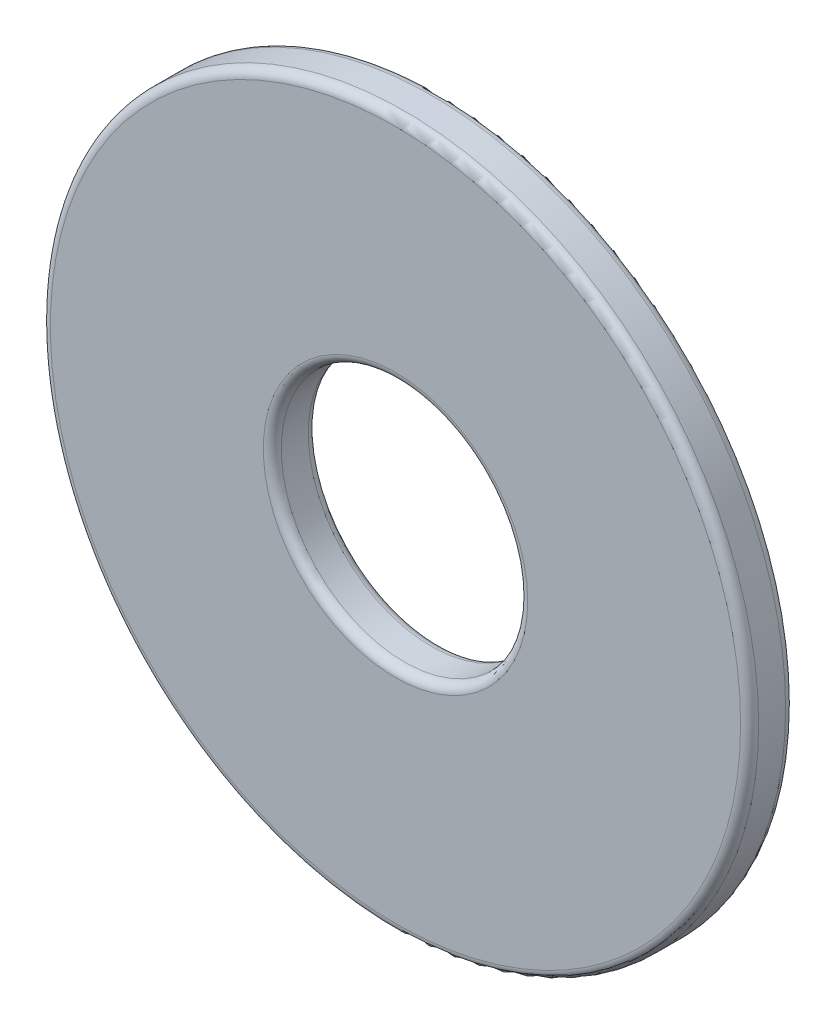
ISO-10303-21;
HEADER;
FILE_DESCRIPTION(('STEP AP214'),'2;1');
FILE_NAME('part.step','',(''),(''),'','','');
FILE_SCHEMA(('AUTOMOTIVE_DESIGN { 1 0 10303 214 1 1 1 1 }'));
ENDSEC;
DATA;
#1=APPLICATION_CONTEXT('core data for automotive mechanical design processes');
#2=APPLICATION_PROTOCOL_DEFINITION('international standard','automotive_design',2000,#1);
#3=PRODUCT_CONTEXT('',#1,'mechanical');
#4=PRODUCT('Part','Part','',(#3));
#5=PRODUCT_RELATED_PRODUCT_CATEGORY('part','',(#4));
#6=PRODUCT_DEFINITION_FORMATION('','',#4);
#7=PRODUCT_DEFINITION_CONTEXT('part definition',#1,'design');
#8=PRODUCT_DEFINITION('design','',#6,#7);
#9=PRODUCT_DEFINITION_SHAPE('','',#8);
#10=(LENGTH_UNIT() NAMED_UNIT(*) SI_UNIT(.MILLI.,.METRE.));
#11=(NAMED_UNIT(*) PLANE_ANGLE_UNIT() SI_UNIT($,.RADIAN.));
#12=(NAMED_UNIT(*) SI_UNIT($,.STERADIAN.) SOLID_ANGLE_UNIT());
#13=UNCERTAINTY_MEASURE_WITH_UNIT(LENGTH_MEASURE(1.E-05),#10,'distance_accuracy_value','');
#14=(GEOMETRIC_REPRESENTATION_CONTEXT(3) GLOBAL_UNCERTAINTY_ASSIGNED_CONTEXT((#13)) GLOBAL_UNIT_ASSIGNED_CONTEXT((#10,
#11,#12)) REPRESENTATION_CONTEXT('',''));
#15=CARTESIAN_POINT('',(0.,0.,0.));
#16=DIRECTION('',(0.,0.,1.));
#17=DIRECTION('',(1.,0.,0.));
#18=AXIS2_PLACEMENT_3D('',#15,#16,#17);
#19=CARTESIAN_POINT('',(0.,0.,-0.806450000000005));
#20=DIRECTION('',(0.,0.,1.));
#21=DIRECTION('',(1.,0.,0.));
#22=AXIS2_PLACEMENT_3D('',#19,#20,#21);
#23=CYLINDRICAL_SURFACE('',#22,12.7);
#24=CARTESIAN_POINT('',(0.,0.,0.483870000000004));
#25=DIRECTION('',(0.,0.,1.));
#26=DIRECTION('',(1.,0.,0.));
#27=AXIS2_PLACEMENT_3D('',#24,#25,#26);
#28=CIRCLE('',#27,12.7);
#29=CARTESIAN_POINT('',(12.7,0.,0.483870000000004));
#30=VERTEX_POINT('',#29);
#31=EDGE_CURVE('E10',#30,#30,#28,.F.);
#32=CARTESIAN_POINT('',(0.,0.,-0.483870000000005));
#33=DIRECTION('',(0.,0.,1.));
#34=DIRECTION('',(1.,0.,0.));
#35=AXIS2_PLACEMENT_3D('',#32,#33,#34);
#36=CIRCLE('',#35,12.7);
#37=CARTESIAN_POINT('',(12.7,0.,-0.483870000000005));
#38=VERTEX_POINT('',#37);
#39=EDGE_CURVE('E42',#38,#38,#36,.T.);
#40=CARTESIAN_POINT('',(12.7,0.,0.483870000000004));
#41=CARTESIAN_POINT('',(12.7,0.,0.473789375000004));
#42=CARTESIAN_POINT('',(12.7,0.,0.463708750000004));
#43=CARTESIAN_POINT('',(12.7,0.,0.443547500000003));
#44=CARTESIAN_POINT('',(12.7,0.,0.433466875000003));
#45=CARTESIAN_POINT('',(12.7,0.,0.413305625000003));
#46=CARTESIAN_POINT('',(12.7,0.,0.403225000000003));
#47=CARTESIAN_POINT('',(12.7,0.,0.383063750000003));
#48=CARTESIAN_POINT('',(12.7,0.,0.372983125000003));
#49=CARTESIAN_POINT('',(12.7,0.,0.352821875000003));
#50=CARTESIAN_POINT('',(12.7,0.,0.342741250000003));
#51=CARTESIAN_POINT('',(12.7,0.,0.322580000000002));
#52=CARTESIAN_POINT('',(12.7,0.,0.312499375000002));
#53=CARTESIAN_POINT('',(12.7,0.,0.292338125000002));
#54=CARTESIAN_POINT('',(12.7,0.,0.282257500000002));
#55=CARTESIAN_POINT('',(12.7,0.,0.262096250000002));
#56=CARTESIAN_POINT('',(12.7,0.,0.252015625000002));
#57=CARTESIAN_POINT('',(12.7,0.,0.231854375000001));
#58=CARTESIAN_POINT('',(12.7,0.,0.221773750000001));
#59=CARTESIAN_POINT('',(12.7,0.,0.201612500000001));
#60=CARTESIAN_POINT('',(12.7,0.,0.191531875000001));
#61=CARTESIAN_POINT('',(12.7,0.,0.171370625000001));
#62=CARTESIAN_POINT('',(12.7,0.,0.161290000000001));
#63=CARTESIAN_POINT('',(12.7,0.,0.141128750000001));
#64=CARTESIAN_POINT('',(12.7,0.,0.131048125000001));
#65=CARTESIAN_POINT('',(12.7,0.,0.110886875));
#66=CARTESIAN_POINT('',(12.7,0.,0.10080625));
#67=CARTESIAN_POINT('',(12.7,0.,0.0806450000000002));
#68=CARTESIAN_POINT('',(12.7,0.,0.0705643750000001));
#69=CARTESIAN_POINT('',(12.7,0.,0.0504031249999999));
#70=CARTESIAN_POINT('',(12.7,0.,0.0403224999999997));
#71=CARTESIAN_POINT('',(12.7,0.,0.0201612499999995));
#72=CARTESIAN_POINT('',(12.7,0.,0.0100806249999994));
#73=CARTESIAN_POINT('',(12.7,0.,-0.0100806250000007));
#74=CARTESIAN_POINT('',(12.7,0.,-0.0201612500000008));
#75=CARTESIAN_POINT('',(12.7,0.,-0.040322500000001));
#76=CARTESIAN_POINT('',(12.7,0.,-0.0504031250000011));
#77=CARTESIAN_POINT('',(12.7,0.,-0.0705643750000013));
#78=CARTESIAN_POINT('',(12.7,0.,-0.0806450000000014));
#79=CARTESIAN_POINT('',(12.7,0.,-0.100806250000002));
#80=CARTESIAN_POINT('',(12.7,0.,-0.110886875000002));
#81=CARTESIAN_POINT('',(12.7,0.,-0.131048125000002));
#82=CARTESIAN_POINT('',(12.7,0.,-0.141128750000002));
#83=CARTESIAN_POINT('',(12.7,0.,-0.161290000000002));
#84=CARTESIAN_POINT('',(12.7,0.,-0.171370625000002));
#85=CARTESIAN_POINT('',(12.7,0.,-0.191531875000002));
#86=CARTESIAN_POINT('',(12.7,0.,-0.201612500000003));
#87=CARTESIAN_POINT('',(12.7,0.,-0.221773750000003));
#88=CARTESIAN_POINT('',(12.7,0.,-0.231854375000003));
#89=CARTESIAN_POINT('',(12.7,0.,-0.252015625000003));
#90=CARTESIAN_POINT('',(12.7,0.,-0.262096250000003));
#91=CARTESIAN_POINT('',(12.7,0.,-0.282257500000003));
#92=CARTESIAN_POINT('',(12.7,0.,-0.292338125000003));
#93=CARTESIAN_POINT('',(12.7,0.,-0.312499375000004));
#94=CARTESIAN_POINT('',(12.7,0.,-0.322580000000004));
#95=CARTESIAN_POINT('',(12.7,0.,-0.342741250000004));
#96=CARTESIAN_POINT('',(12.7,0.,-0.352821875000004));
#97=CARTESIAN_POINT('',(12.7,0.,-0.372983125000004));
#98=CARTESIAN_POINT('',(12.7,0.,-0.383063750000004));
#99=CARTESIAN_POINT('',(12.7,0.,-0.403225000000004));
#100=CARTESIAN_POINT('',(12.7,0.,-0.413305625000005));
#101=CARTESIAN_POINT('',(12.7,0.,-0.433466875000005));
#102=CARTESIAN_POINT('',(12.7,0.,-0.443547500000005));
#103=CARTESIAN_POINT('',(12.7,0.,-0.463708750000005));
#104=CARTESIAN_POINT('',(12.7,0.,-0.473789375000005));
#105=CARTESIAN_POINT('',(12.7,0.,-0.483870000000005));
#106=B_SPLINE_CURVE_WITH_KNOTS('',3,(#40,#41,#42,#43,#44,#45,#46,#47,#48,#49,#50,#51,#52,#53,
#54,#55,#56,#57,#58,#59,#60,#61,#62,#63,#64,#65,#66,#67,#68,#69,#70,#71,#72,#73,#74,#75,#76,#77,
#78,#79,#80,#81,#82,#83,#84,#85,#86,#87,#88,#89,#90,#91,#92,#93,#94,#95,#96,#97,#98,#99,#100,
#101,#102,#103,#104,#105),.UNSPECIFIED.,.F.,.F.,(4,2,2,2,2,2,2,2,2,2,2,2,2,2,2,2,2,2,2,2,2,2,2,
2,2,2,2,2,2,2,2,2,4),(0.,0.0302418750000003,0.0604837500000005,0.0907256250000008,
0.120967500000001,0.151209375000001,0.181451250000002,0.211693125000002,0.241935000000002,
0.272176875000003,0.302418750000003,0.332660625000003,0.362902500000003,0.393144375000004,
0.423386250000004,0.453628125000004,0.483870000000005,0.514111875000005,0.544353750000005,
0.574595625000005,0.604837500000006,0.635079375000006,0.665321250000006,0.695563125000006,
0.725805000000007,0.756046875000007,0.786288750000007,0.816530625000008,0.846772500000008,
0.877014375000008,0.907256250000009,0.937498125000009,0.967740000000009),.UNSPECIFIED.);
#107=EDGE_CURVE('BSEAM35',#30,#38,#106,.T.);
#108=ORIENTED_EDGE('',*,*,#31,.T.);
#109=ORIENTED_EDGE('',*,*,#39,.T.);
#110=ORIENTED_EDGE('',*,*,#107,.T.);
#111=ORIENTED_EDGE('',*,*,#107,.F.);
#112=EDGE_LOOP('',(#108,#110,#109,#111));
#113=FACE_BOUND('',#112,.T.);
#114=ADVANCED_FACE('F35',(#113),#23,.T.);
#115=CARTESIAN_POINT('',(0.,0.,-0.806450000000005));
#116=DIRECTION('',(0.,0.,1.));
#117=DIRECTION('',(1.,0.,0.));
#118=AXIS2_PLACEMENT_3D('',#115,#116,#117);
#119=PLANE('',#118);
#120=CARTESIAN_POINT('',(0.,0.,-0.806450000000005));
#121=DIRECTION('',(0.,0.,1.));
#122=DIRECTION('',(1.,0.,0.));
#123=AXIS2_PLACEMENT_3D('',#120,#121,#122);
#124=CIRCLE('',#123,4.74218);
#125=CARTESIAN_POINT('',(4.74218,0.,-0.806450000000005));
#126=VERTEX_POINT('',#125);
#127=EDGE_CURVE('E46',#126,#126,#124,.T.);
#128=ORIENTED_EDGE('',*,*,#127,.T.);
#129=EDGE_LOOP('',(#128));
#130=FACE_BOUND('',#129,.T.);
#131=CARTESIAN_POINT('',(0.,0.,-0.806450000000005));
#132=DIRECTION('',(0.,0.,1.));
#133=DIRECTION('',(1.,0.,0.));
#134=AXIS2_PLACEMENT_3D('',#131,#132,#133);
#135=CIRCLE('',#134,12.37742);
#136=CARTESIAN_POINT('',(12.37742,0.,-0.806450000000005));
#137=VERTEX_POINT('',#136);
#138=EDGE_CURVE('E50',#137,#137,#135,.F.);
#139=ORIENTED_EDGE('',*,*,#138,.T.);
#140=EDGE_LOOP('',(#139));
#141=FACE_BOUND('',#140,.T.);
#142=ADVANCED_FACE('F78',(#130,#141),#119,.F.);
#143=CARTESIAN_POINT('',(0.,0.,0.806450000000004));
#144=DIRECTION('',(0.,0.,1.));
#145=DIRECTION('',(1.,0.,0.));
#146=AXIS2_PLACEMENT_3D('',#143,#144,#145);
#147=PLANE('',#146);
#148=CARTESIAN_POINT('',(0.,0.,0.806450000000004));
#149=DIRECTION('',(0.,0.,1.));
#150=DIRECTION('',(1.,0.,0.));
#151=AXIS2_PLACEMENT_3D('',#148,#149,#150);
#152=CIRCLE('',#151,4.74218);
#153=CARTESIAN_POINT('',(4.74218,0.,0.806450000000004));
#154=VERTEX_POINT('',#153);
#155=EDGE_CURVE('E55',#154,#154,#152,.F.);
#156=ORIENTED_EDGE('',*,*,#155,.T.);
#157=EDGE_LOOP('',(#156));
#158=FACE_BOUND('',#157,.T.);
#159=CARTESIAN_POINT('',(0.,0.,0.806450000000004));
#160=DIRECTION('',(0.,0.,1.));
#161=DIRECTION('',(1.,0.,0.));
#162=AXIS2_PLACEMENT_3D('',#159,#160,#161);
#163=CIRCLE('',#162,12.37742);
#164=CARTESIAN_POINT('',(12.37742,0.,0.806450000000004));
#165=VERTEX_POINT('',#164);
#166=EDGE_CURVE('E58',#165,#165,#163,.T.);
#167=ORIENTED_EDGE('',*,*,#166,.T.);
#168=EDGE_LOOP('',(#167));
#169=FACE_BOUND('',#168,.T.);
#170=ADVANCED_FACE('F81',(#158,#169),#147,.T.);
#171=CARTESIAN_POINT('',(0.,0.,-0.806450000000005));
#172=DIRECTION('',(0.,0.,1.));
#173=DIRECTION('',(1.,0.,0.));
#174=AXIS2_PLACEMENT_3D('',#171,#172,#173);
#175=CYLINDRICAL_SURFACE('',#174,4.4196);
#176=CARTESIAN_POINT('',(0.,0.,0.483870000000004));
#177=DIRECTION('',(0.,0.,1.));
#178=DIRECTION('',(1.,0.,0.));
#179=AXIS2_PLACEMENT_3D('',#176,#177,#178);
#180=CIRCLE('',#179,4.4196);
#181=CARTESIAN_POINT('',(4.4196,0.,0.483870000000004));
#182=VERTEX_POINT('',#181);
#183=EDGE_CURVE('E61',#182,#182,#180,.T.);
#184=CARTESIAN_POINT('',(0.,0.,-0.483870000000005));
#185=DIRECTION('',(0.,0.,1.));
#186=DIRECTION('',(1.,0.,0.));
#187=AXIS2_PLACEMENT_3D('',#184,#185,#186);
#188=CIRCLE('',#187,4.4196);
#189=CARTESIAN_POINT('',(4.4196,0.,-0.483870000000005));
#190=VERTEX_POINT('',#189);
#191=EDGE_CURVE('E64',#190,#190,#188,.F.);
#192=CARTESIAN_POINT('',(4.4196,0.,0.483870000000004));
#193=CARTESIAN_POINT('',(4.4196,0.,0.473789375000004));
#194=CARTESIAN_POINT('',(4.4196,0.,0.463708750000004));
#195=CARTESIAN_POINT('',(4.4196,0.,0.443547500000003));
#196=CARTESIAN_POINT('',(4.4196,0.,0.433466875000003));
#197=CARTESIAN_POINT('',(4.4196,0.,0.413305625000003));
#198=CARTESIAN_POINT('',(4.4196,0.,0.403225000000003));
#199=CARTESIAN_POINT('',(4.4196,0.,0.383063750000003));
#200=CARTESIAN_POINT('',(4.4196,0.,0.372983125000003));
#201=CARTESIAN_POINT('',(4.4196,0.,0.352821875000003));
#202=CARTESIAN_POINT('',(4.4196,0.,0.342741250000003));
#203=CARTESIAN_POINT('',(4.4196,0.,0.322580000000002));
#204=CARTESIAN_POINT('',(4.4196,0.,0.312499375000002));
#205=CARTESIAN_POINT('',(4.4196,0.,0.292338125000002));
#206=CARTESIAN_POINT('',(4.4196,0.,0.282257500000002));
#207=CARTESIAN_POINT('',(4.4196,0.,0.262096250000002));
#208=CARTESIAN_POINT('',(4.4196,0.,0.252015625000002));
#209=CARTESIAN_POINT('',(4.4196,0.,0.231854375000001));
#210=CARTESIAN_POINT('',(4.4196,0.,0.221773750000001));
#211=CARTESIAN_POINT('',(4.4196,0.,0.201612500000001));
#212=CARTESIAN_POINT('',(4.4196,0.,0.191531875000001));
#213=CARTESIAN_POINT('',(4.4196,0.,0.171370625000001));
#214=CARTESIAN_POINT('',(4.4196,0.,0.161290000000001));
#215=CARTESIAN_POINT('',(4.4196,0.,0.141128750000001));
#216=CARTESIAN_POINT('',(4.4196,0.,0.131048125000001));
#217=CARTESIAN_POINT('',(4.4196,0.,0.110886875));
#218=CARTESIAN_POINT('',(4.4196,0.,0.10080625));
#219=CARTESIAN_POINT('',(4.4196,0.,0.0806450000000002));
#220=CARTESIAN_POINT('',(4.4196,0.,0.0705643750000001));
#221=CARTESIAN_POINT('',(4.4196,0.,0.0504031249999999));
#222=CARTESIAN_POINT('',(4.4196,0.,0.0403224999999997));
#223=CARTESIAN_POINT('',(4.4196,0.,0.0201612499999995));
#224=CARTESIAN_POINT('',(4.4196,0.,0.0100806249999994));
#225=CARTESIAN_POINT('',(4.4196,0.,-0.0100806250000007));
#226=CARTESIAN_POINT('',(4.4196,0.,-0.0201612500000008));
#227=CARTESIAN_POINT('',(4.4196,0.,-0.040322500000001));
#228=CARTESIAN_POINT('',(4.4196,0.,-0.0504031250000011));
#229=CARTESIAN_POINT('',(4.4196,0.,-0.0705643750000013));
#230=CARTESIAN_POINT('',(4.4196,0.,-0.0806450000000014));
#231=CARTESIAN_POINT('',(4.4196,0.,-0.100806250000002));
#232=CARTESIAN_POINT('',(4.4196,0.,-0.110886875000002));
#233=CARTESIAN_POINT('',(4.4196,0.,-0.131048125000002));
#234=CARTESIAN_POINT('',(4.4196,0.,-0.141128750000002));
#235=CARTESIAN_POINT('',(4.4196,0.,-0.161290000000002));
#236=CARTESIAN_POINT('',(4.4196,0.,-0.171370625000002));
#237=CARTESIAN_POINT('',(4.4196,0.,-0.191531875000002));
#238=CARTESIAN_POINT('',(4.4196,0.,-0.201612500000003));
#239=CARTESIAN_POINT('',(4.4196,0.,-0.221773750000003));
#240=CARTESIAN_POINT('',(4.4196,0.,-0.231854375000003));
#241=CARTESIAN_POINT('',(4.4196,0.,-0.252015625000003));
#242=CARTESIAN_POINT('',(4.4196,0.,-0.262096250000003));
#243=CARTESIAN_POINT('',(4.4196,0.,-0.282257500000003));
#244=CARTESIAN_POINT('',(4.4196,0.,-0.292338125000003));
#245=CARTESIAN_POINT('',(4.4196,0.,-0.312499375000004));
#246=CARTESIAN_POINT('',(4.4196,0.,-0.322580000000004));
#247=CARTESIAN_POINT('',(4.4196,0.,-0.342741250000004));
#248=CARTESIAN_POINT('',(4.4196,0.,-0.352821875000004));
#249=CARTESIAN_POINT('',(4.4196,0.,-0.372983125000004));
#250=CARTESIAN_POINT('',(4.4196,0.,-0.383063750000004));
#251=CARTESIAN_POINT('',(4.4196,0.,-0.403225000000004));
#252=CARTESIAN_POINT('',(4.4196,0.,-0.413305625000005));
#253=CARTESIAN_POINT('',(4.4196,0.,-0.433466875000005));
#254=CARTESIAN_POINT('',(4.4196,0.,-0.443547500000005));
#255=CARTESIAN_POINT('',(4.4196,0.,-0.463708750000005));
#256=CARTESIAN_POINT('',(4.4196,0.,-0.473789375000005));
#257=CARTESIAN_POINT('',(4.4196,0.,-0.483870000000005));
#258=B_SPLINE_CURVE_WITH_KNOTS('',3,(#192,#193,#194,#195,#196,#197,#198,#199,#200,#201,#202,
#203,#204,#205,#206,#207,#208,#209,#210,#211,#212,#213,#214,#215,#216,#217,#218,#219,#220,#221,
#222,#223,#224,#225,#226,#227,#228,#229,#230,#231,#232,#233,#234,#235,#236,#237,#238,#239,#240,
#241,#242,#243,#244,#245,#246,#247,#248,#249,#250,#251,#252,#253,#254,#255,#256,#257),
.UNSPECIFIED.,.F.,.F.,(4,2,2,2,2,2,2,2,2,2,2,2,2,2,2,2,2,2,2,2,2,2,2,2,2,2,2,2,2,2,2,2,4),(0.,
0.0302418750000003,0.0604837500000005,0.0907256250000008,0.120967500000001,0.151209375000001,
0.181451250000002,0.211693125000002,0.241935000000002,0.272176875000003,0.302418750000003,
0.332660625000003,0.362902500000003,0.393144375000004,0.423386250000004,0.453628125000004,
0.483870000000005,0.514111875000005,0.544353750000005,0.574595625000005,0.604837500000006,
0.635079375000006,0.665321250000006,0.695563125000006,0.725805000000007,0.756046875000007,
0.786288750000007,0.816530625000008,0.846772500000008,0.877014375000008,0.907256250000009,
0.937498125000009,0.967740000000009),.UNSPECIFIED.);
#259=EDGE_CURVE('BSEAM68',#182,#190,#258,.T.);
#260=ORIENTED_EDGE('',*,*,#183,.T.);
#261=ORIENTED_EDGE('',*,*,#191,.T.);
#262=ORIENTED_EDGE('',*,*,#259,.T.);
#263=ORIENTED_EDGE('',*,*,#259,.F.);
#264=EDGE_LOOP('',(#260,#262,#261,#263));
#265=FACE_BOUND('',#264,.T.);
#266=ADVANCED_FACE('F68',(#265),#175,.F.);
#267=CARTESIAN_POINT('',(0.,0.,0.483870000000004));
#268=DIRECTION('',(0.,0.,1.));
#269=DIRECTION('',(1.,0.,0.));
#270=AXIS2_PLACEMENT_3D('',#267,#268,#269);
#271=TOROIDAL_SURFACE('',#270,4.74218,0.32258);
#272=ORIENTED_EDGE('',*,*,#155,.F.);
#273=EDGE_LOOP('',(#272));
#274=FACE_BOUND('',#273,.T.);
#275=ORIENTED_EDGE('',*,*,#183,.F.);
#276=EDGE_LOOP('',(#275));
#277=FACE_BOUND('',#276,.T.);
#278=ADVANCED_FACE('F74',(#274,#277),#271,.T.);
#279=CARTESIAN_POINT('',(0.,0.,-0.483870000000005));
#280=DIRECTION('',(0.,0.,1.));
#281=DIRECTION('',(1.,0.,0.));
#282=AXIS2_PLACEMENT_3D('',#279,#280,#281);
#283=TOROIDAL_SURFACE('',#282,4.74218,0.32258);
#284=ORIENTED_EDGE('',*,*,#191,.F.);
#285=EDGE_LOOP('',(#284));
#286=FACE_BOUND('',#285,.T.);
#287=ORIENTED_EDGE('',*,*,#127,.F.);
#288=EDGE_LOOP('',(#287));
#289=FACE_BOUND('',#288,.T.);
#290=ADVANCED_FACE('F70',(#286,#289),#283,.T.);
#291=CARTESIAN_POINT('',(0.,0.,0.483870000000004));
#292=DIRECTION('',(0.,0.,1.));
#293=DIRECTION('',(1.,0.,0.));
#294=AXIS2_PLACEMENT_3D('',#291,#292,#293);
#295=TOROIDAL_SURFACE('',#294,12.37742,0.32258);
#296=ORIENTED_EDGE('',*,*,#31,.F.);
#297=EDGE_LOOP('',(#296));
#298=FACE_BOUND('',#297,.T.);
#299=ORIENTED_EDGE('',*,*,#166,.F.);
#300=EDGE_LOOP('',(#299));
#301=FACE_BOUND('',#300,.T.);
#302=ADVANCED_FACE('F73',(#298,#301),#295,.T.);
#303=CARTESIAN_POINT('',(0.,0.,-0.483870000000005));
#304=DIRECTION('',(0.,0.,1.));
#305=DIRECTION('',(1.,0.,0.));
#306=AXIS2_PLACEMENT_3D('',#303,#304,#305);
#307=TOROIDAL_SURFACE('',#306,12.37742,0.32258);
#308=ORIENTED_EDGE('',*,*,#138,.F.);
#309=EDGE_LOOP('',(#308));
#310=FACE_BOUND('',#309,.T.);
#311=ORIENTED_EDGE('',*,*,#39,.F.);
#312=EDGE_LOOP('',(#311));
#313=FACE_BOUND('',#312,.T.);
#314=ADVANCED_FACE('F37',(#310,#313),#307,.T.);
#315=CLOSED_SHELL('',(#114,#142,#170,#266,#278,#290,#302,#314));
#316=MANIFOLD_SOLID_BREP('B2',#315);
#317=ADVANCED_BREP_SHAPE_REPRESENTATION('',(#18,#316),#14);
#318=SHAPE_DEFINITION_REPRESENTATION(#9,#317);
ENDSEC;
END-ISO-10303-21;
